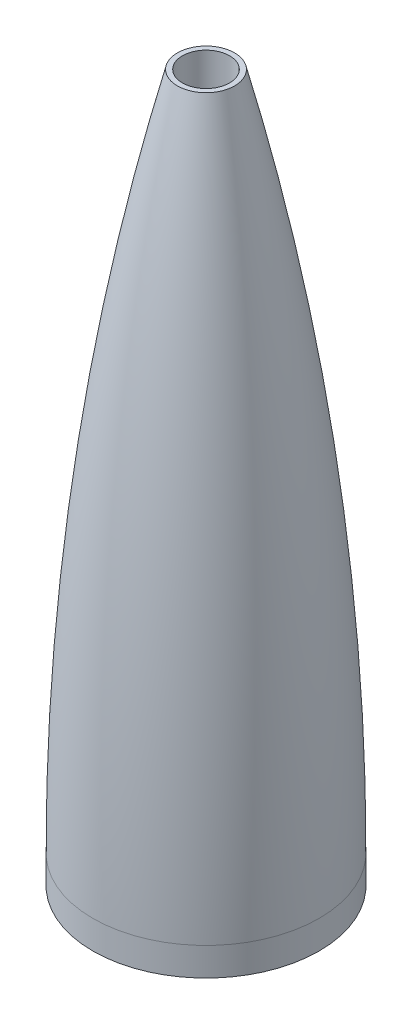
ISO-10303-21;
HEADER;
FILE_DESCRIPTION(('STEP AP214'),'2;1');
FILE_NAME('part.step','',(''),(''),'','','');
FILE_SCHEMA(('AUTOMOTIVE_DESIGN { 1 0 10303 214 1 1 1 1 }'));
ENDSEC;
DATA;
#1=APPLICATION_CONTEXT('core data for automotive mechanical design processes');
#2=APPLICATION_PROTOCOL_DEFINITION('international standard','automotive_design',2000,#1);
#3=PRODUCT_CONTEXT('',#1,'mechanical');
#4=PRODUCT('Part','Part','',(#3));
#5=PRODUCT_RELATED_PRODUCT_CATEGORY('part','',(#4));
#6=PRODUCT_DEFINITION_FORMATION('','',#4);
#7=PRODUCT_DEFINITION_CONTEXT('part definition',#1,'design');
#8=PRODUCT_DEFINITION('design','',#6,#7);
#9=PRODUCT_DEFINITION_SHAPE('','',#8);
#10=(LENGTH_UNIT() NAMED_UNIT(*) SI_UNIT(.MILLI.,.METRE.));
#11=(NAMED_UNIT(*) PLANE_ANGLE_UNIT() SI_UNIT($,.RADIAN.));
#12=(NAMED_UNIT(*) SI_UNIT($,.STERADIAN.) SOLID_ANGLE_UNIT());
#13=UNCERTAINTY_MEASURE_WITH_UNIT(LENGTH_MEASURE(1.E-05),#10,'distance_accuracy_value','');
#14=(GEOMETRIC_REPRESENTATION_CONTEXT(3) GLOBAL_UNCERTAINTY_ASSIGNED_CONTEXT((#13)) GLOBAL_UNIT_ASSIGNED_CONTEXT((#10,
#11,#12)) REPRESENTATION_CONTEXT('',''));
#15=CARTESIAN_POINT('',(0.,0.,0.));
#16=DIRECTION('',(0.,0.,1.));
#17=DIRECTION('',(1.,0.,0.));
#18=AXIS2_PLACEMENT_3D('',#15,#16,#17);
#19=CARTESIAN_POINT('',(-2.22044604925031E-13,3479.8,0.));
#20=DIRECTION('',(0.,-1.,0.));
#21=DIRECTION('',(1.,0.,0.));
#22=AXIS2_PLACEMENT_3D('',#19,#20,#21);
#23=DEGENERATE_TOROIDAL_SURFACE('',#22,1788.26239535152,1862.63359535152,.F.);
#24=CARTESIAN_POINT('',(-1.86139666355911E-13,3479.8,0.));
#25=DIRECTION('',(0.,-1.,0.));
#26=DIRECTION('',(1.,0.,0.));
#27=AXIS2_PLACEMENT_3D('',#24,#25,#26);
#28=CIRCLE('',#27,74.3711999999999);
#29=CARTESIAN_POINT('',(74.3711999999997,3479.8,0.));
#30=VERTEX_POINT('',#29);
#31=EDGE_CURVE('E71',#30,#30,#28,.T.);
#32=ORIENTED_EDGE('',*,*,#31,.T.);
#33=EDGE_LOOP('',(#32));
#34=FACE_BOUND('',#33,.T.);
#35=CARTESIAN_POINT('',(-2.10498147658311E-13,3935.1712,0.));
#36=DIRECTION('',(0.,-1.,0.));
#37=DIRECTION('',(1.,0.,0.));
#38=AXIS2_PLACEMENT_3D('',#35,#36,#37);
#39=CIRCLE('',#38,17.849722082691);
#40=CARTESIAN_POINT('',(17.8497220826908,3935.1712,0.));
#41=VERTEX_POINT('',#40);
#42=EDGE_CURVE('E10',#41,#41,#39,.T.);
#43=ORIENTED_EDGE('',*,*,#42,.F.);
#44=EDGE_LOOP('',(#43));
#45=FACE_BOUND('',#44,.T.);
#46=ADVANCED_FACE('F37',(#34,#45),#23,.T.);
#47=CARTESIAN_POINT('',(2.3952057654364E-08,3935.1712,0.));
#48=DIRECTION('',(0.,1.,0.));
#49=DIRECTION('',(-1.,0.,0.));
#50=AXIS2_PLACEMENT_3D('',#47,#48,#49);
#51=PLANE('',#50);
#52=CARTESIAN_POINT('',(-2.10498147658311E-13,3935.1712,0.));
#53=DIRECTION('',(0.,-1.,0.));
#54=DIRECTION('',(1.,0.,0.));
#55=AXIS2_PLACEMENT_3D('',#52,#53,#54);
#56=CIRCLE('',#55,17.7037999999998);
#57=CARTESIAN_POINT('',(17.7037999999995,3935.1712,0.));
#58=VERTEX_POINT('',#57);
#59=EDGE_CURVE('E43',#58,#58,#56,.T.);
#60=ORIENTED_EDGE('',*,*,#59,.F.);
#61=EDGE_LOOP('',(#60));
#62=FACE_BOUND('',#61,.T.);
#63=ORIENTED_EDGE('',*,*,#42,.T.);
#64=EDGE_LOOP('',(#63));
#65=FACE_BOUND('',#64,.T.);
#66=ADVANCED_FACE('F95',(#62,#65),#51,.F.);
#67=CARTESIAN_POINT('',(0.,0.,0.));
#68=DIRECTION('',(0.,-1.,0.));
#69=DIRECTION('',(1.,0.,0.));
#70=AXIS2_PLACEMENT_3D('',#67,#68,#69);
#71=CYLINDRICAL_SURFACE('',#70,17.7037999999998);
#72=CARTESIAN_POINT('',(-2.09237289188397E-13,3911.6,0.));
#73=DIRECTION('',(0.,-1.,0.));
#74=DIRECTION('',(1.,0.,0.));
#75=AXIS2_PLACEMENT_3D('',#72,#73,#74);
#76=CIRCLE('',#75,17.7037999999998);
#77=CARTESIAN_POINT('',(17.7037999999995,3911.6,0.));
#78=VERTEX_POINT('',#77);
#79=EDGE_CURVE('E47',#78,#78,#76,.T.);
#80=ORIENTED_EDGE('',*,*,#79,.F.);
#81=EDGE_LOOP('',(#80));
#82=FACE_BOUND('',#81,.T.);
#83=ORIENTED_EDGE('',*,*,#59,.T.);
#84=EDGE_LOOP('',(#83));
#85=FACE_BOUND('',#84,.T.);
#86=ADVANCED_FACE('F99',(#82,#85),#71,.T.);
#87=CARTESIAN_POINT('',(0.,3911.6,0.));
#88=DIRECTION('',(0.,1.,0.));
#89=DIRECTION('',(-1.,0.,0.));
#90=AXIS2_PLACEMENT_3D('',#87,#88,#89);
#91=PLANE('',#90);
#92=CARTESIAN_POINT('',(-2.09237289188397E-13,3911.6,0.));
#93=DIRECTION('',(0.,-1.,0.));
#94=DIRECTION('',(1.,0.,0.));
#95=AXIS2_PLACEMENT_3D('',#92,#93,#94);
#96=CIRCLE('',#95,15.8749999999998);
#97=CARTESIAN_POINT('',(15.8749999999995,3911.6,0.));
#98=VERTEX_POINT('',#97);
#99=EDGE_CURVE('E51',#98,#98,#96,.T.);
#100=ORIENTED_EDGE('',*,*,#99,.F.);
#101=EDGE_LOOP('',(#100));
#102=FACE_BOUND('',#101,.T.);
#103=ORIENTED_EDGE('',*,*,#79,.T.);
#104=EDGE_LOOP('',(#103));
#105=FACE_BOUND('',#104,.T.);
#106=ADVANCED_FACE('F104',(#102,#105),#91,.F.);
#107=CARTESIAN_POINT('',(0.,0.,0.));
#108=DIRECTION('',(0.,-1.,0.));
#109=DIRECTION('',(1.,0.,0.));
#110=AXIS2_PLACEMENT_3D('',#107,#108,#109);
#111=CYLINDRICAL_SURFACE('',#110,15.8749999999998);
#112=ORIENTED_EDGE('',*,*,#99,.T.);
#113=EDGE_LOOP('',(#112));
#114=FACE_BOUND('',#113,.T.);
#115=CARTESIAN_POINT('',(-2.10595972884425E-13,3937.,0.));
#116=DIRECTION('',(0.,-1.,0.));
#117=DIRECTION('',(1.,0.,0.));
#118=AXIS2_PLACEMENT_3D('',#115,#116,#117);
#119=CIRCLE('',#118,15.8749999999998);
#120=CARTESIAN_POINT('',(15.8749999999995,3937.,0.));
#121=VERTEX_POINT('',#120);
#122=EDGE_CURVE('E56',#121,#121,#119,.T.);
#123=ORIENTED_EDGE('',*,*,#122,.F.);
#124=EDGE_LOOP('',(#123));
#125=FACE_BOUND('',#124,.T.);
#126=ADVANCED_FACE('F110',(#114,#125),#111,.F.);
#127=CARTESIAN_POINT('',(1.02873053695894E-09,3937.,0.));
#128=DIRECTION('',(0.,1.,0.));
#129=DIRECTION('',(-1.,0.,0.));
#130=AXIS2_PLACEMENT_3D('',#127,#128,#129);
#131=PLANE('',#130);
#132=ORIENTED_EDGE('',*,*,#122,.T.);
#133=EDGE_LOOP('',(#132));
#134=FACE_BOUND('',#133,.T.);
#135=CARTESIAN_POINT('',(-2.10595972884425E-13,3937.,0.));
#136=DIRECTION('',(0.,-1.,0.));
#137=DIRECTION('',(1.,0.,0.));
#138=AXIS2_PLACEMENT_3D('',#135,#136,#137);
#139=CIRCLE('',#138,19.2741004570507);
#140=CARTESIAN_POINT('',(19.2741004570505,3937.,0.));
#141=VERTEX_POINT('',#140);
#142=EDGE_CURVE('E59',#141,#141,#139,.T.);
#143=ORIENTED_EDGE('',*,*,#142,.F.);
#144=EDGE_LOOP('',(#143));
#145=FACE_BOUND('',#144,.T.);
#146=ADVANCED_FACE('F114',(#134,#145),#131,.T.);
#147=CARTESIAN_POINT('',(-2.22044604925031E-13,3479.8,0.));
#148=DIRECTION('',(0.,-1.,0.));
#149=DIRECTION('',(1.,0.,0.));
#150=AXIS2_PLACEMENT_3D('',#147,#148,#149);
#151=DEGENERATE_TOROIDAL_SURFACE('',#150,1788.26239535152,1864.46239535152,.F.);
#152=CARTESIAN_POINT('',(-1.86139666355911E-13,3479.8,0.));
#153=DIRECTION('',(0.,-1.,0.));
#154=DIRECTION('',(1.,0.,0.));
#155=AXIS2_PLACEMENT_3D('',#152,#153,#154);
#156=CIRCLE('',#155,76.1999999999999);
#157=CARTESIAN_POINT('',(76.1999999999997,3479.8,0.));
#158=VERTEX_POINT('',#157);
#159=EDGE_CURVE('E62',#158,#158,#156,.T.);
#160=ORIENTED_EDGE('',*,*,#159,.F.);
#161=EDGE_LOOP('',(#160));
#162=FACE_BOUND('',#161,.T.);
#163=ORIENTED_EDGE('',*,*,#142,.T.);
#164=EDGE_LOOP('',(#163));
#165=FACE_BOUND('',#164,.T.);
#166=ADVANCED_FACE('F91',(#162,#165),#151,.F.);
#167=CARTESIAN_POINT('',(0.,0.,0.));
#168=DIRECTION('',(0.,-1.,0.));
#169=DIRECTION('',(1.,0.,0.));
#170=AXIS2_PLACEMENT_3D('',#167,#168,#169);
#171=CYLINDRICAL_SURFACE('',#170,76.1999999999998);
#172=ORIENTED_EDGE('',*,*,#159,.T.);
#173=EDGE_LOOP('',(#172));
#174=FACE_BOUND('',#173,.T.);
#175=CARTESIAN_POINT('',(-1.8512065358389E-13,3460.75,0.));
#176=DIRECTION('',(0.,-1.,0.));
#177=DIRECTION('',(1.,0.,0.));
#178=AXIS2_PLACEMENT_3D('',#175,#176,#177);
#179=CIRCLE('',#178,76.1999999999998);
#180=CARTESIAN_POINT('',(76.1999999999997,3460.75,0.));
#181=VERTEX_POINT('',#180);
#182=EDGE_CURVE('E65',#181,#181,#179,.T.);
#183=ORIENTED_EDGE('',*,*,#182,.F.);
#184=EDGE_LOOP('',(#183));
#185=FACE_BOUND('',#184,.T.);
#186=ADVANCED_FACE('F85',(#174,#185),#171,.T.);
#187=CARTESIAN_POINT('',(0.,3460.75,0.));
#188=DIRECTION('',(0.,-1.,0.));
#189=DIRECTION('',(1.,0.,0.));
#190=AXIS2_PLACEMENT_3D('',#187,#188,#189);
#191=PLANE('',#190);
#192=ORIENTED_EDGE('',*,*,#182,.T.);
#193=EDGE_LOOP('',(#192));
#194=FACE_BOUND('',#193,.T.);
#195=CARTESIAN_POINT('',(-1.8512065358389E-13,3460.75,0.));
#196=DIRECTION('',(0.,-1.,0.));
#197=DIRECTION('',(1.,0.,0.));
#198=AXIS2_PLACEMENT_3D('',#195,#196,#197);
#199=CIRCLE('',#198,74.3711999999998);
#200=CARTESIAN_POINT('',(74.3711999999996,3460.75,0.));
#201=VERTEX_POINT('',#200);
#202=EDGE_CURVE('E68',#201,#201,#199,.T.);
#203=ORIENTED_EDGE('',*,*,#202,.F.);
#204=EDGE_LOOP('',(#203));
#205=FACE_BOUND('',#204,.T.);
#206=ADVANCED_FACE('F80',(#194,#205),#191,.T.);
#207=CARTESIAN_POINT('',(0.,0.,0.));
#208=DIRECTION('',(0.,-1.,0.));
#209=DIRECTION('',(1.,0.,0.));
#210=AXIS2_PLACEMENT_3D('',#207,#208,#209);
#211=CYLINDRICAL_SURFACE('',#210,74.3711999999999);
#212=ORIENTED_EDGE('',*,*,#31,.F.);
#213=EDGE_LOOP('',(#212));
#214=FACE_BOUND('',#213,.T.);
#215=ORIENTED_EDGE('',*,*,#202,.T.);
#216=EDGE_LOOP('',(#215));
#217=FACE_BOUND('',#216,.T.);
#218=ADVANCED_FACE('F77',(#214,#217),#211,.F.);
#219=CLOSED_SHELL('',(#46,#66,#86,#106,#126,#146,#166,#186,#206,#218));
#220=MANIFOLD_SOLID_BREP('B2',#219);
#221=ADVANCED_BREP_SHAPE_REPRESENTATION('',(#18,#220),#14);
#222=SHAPE_DEFINITION_REPRESENTATION(#9,#221);
ENDSEC;
END-ISO-10303-21;
